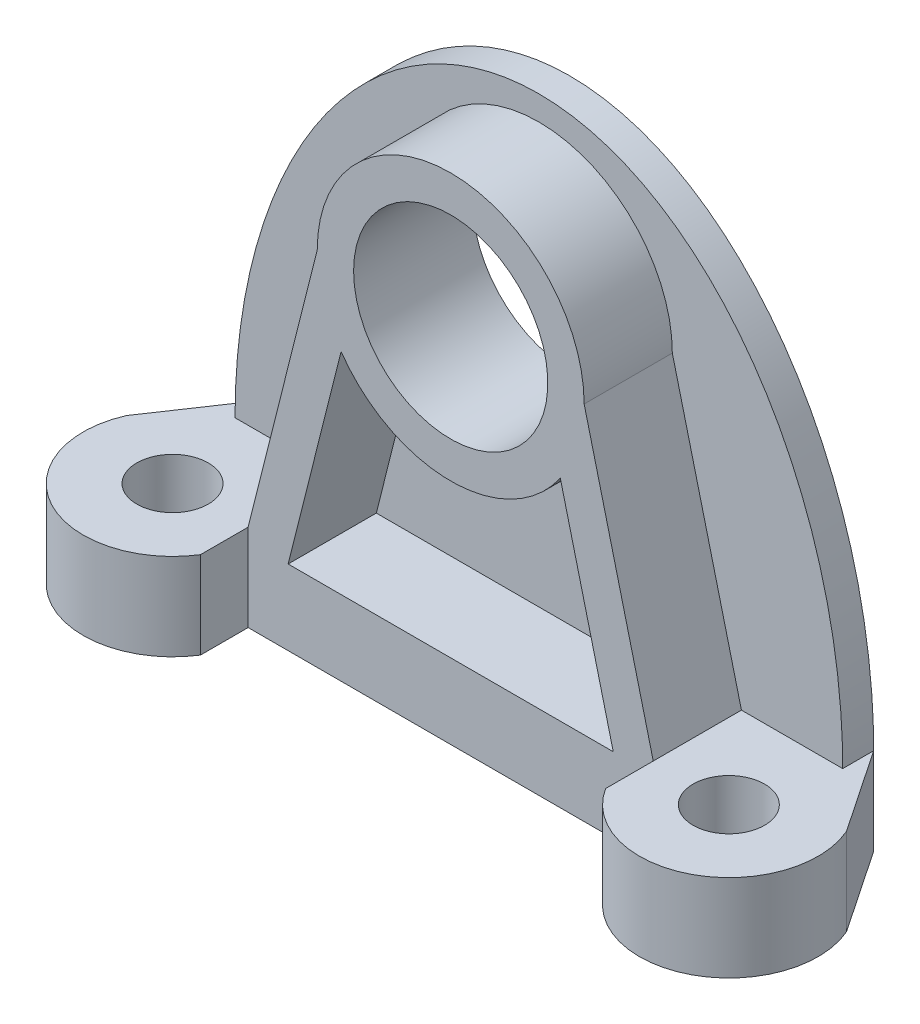
ISO-10303-21;
HEADER;
FILE_DESCRIPTION(('STEP AP214'),'2;1');
FILE_NAME('part.step','',(''),(''),'','','');
FILE_SCHEMA(('AUTOMOTIVE_DESIGN { 1 0 10303 214 1 1 1 1 }'));
ENDSEC;
DATA;
#1=APPLICATION_CONTEXT('core data for automotive mechanical design processes');
#2=APPLICATION_PROTOCOL_DEFINITION('international standard','automotive_design',2000,#1);
#3=PRODUCT_CONTEXT('',#1,'mechanical');
#4=PRODUCT('Part','Part','',(#3));
#5=PRODUCT_RELATED_PRODUCT_CATEGORY('part','',(#4));
#6=PRODUCT_DEFINITION_FORMATION('','',#4);
#7=PRODUCT_DEFINITION_CONTEXT('part definition',#1,'design');
#8=PRODUCT_DEFINITION('design','',#6,#7);
#9=PRODUCT_DEFINITION_SHAPE('','',#8);
#10=(LENGTH_UNIT() NAMED_UNIT(*) SI_UNIT(.MILLI.,.METRE.));
#11=(NAMED_UNIT(*) PLANE_ANGLE_UNIT() SI_UNIT($,.RADIAN.));
#12=(NAMED_UNIT(*) SI_UNIT($,.STERADIAN.) SOLID_ANGLE_UNIT());
#13=UNCERTAINTY_MEASURE_WITH_UNIT(LENGTH_MEASURE(1.E-05),#10,'distance_accuracy_value','');
#14=(GEOMETRIC_REPRESENTATION_CONTEXT(3) GLOBAL_UNCERTAINTY_ASSIGNED_CONTEXT((#13)) GLOBAL_UNIT_ASSIGNED_CONTEXT((#10,
#11,#12)) REPRESENTATION_CONTEXT('',''));
#15=CARTESIAN_POINT('',(0.,0.,0.));
#16=DIRECTION('',(0.,0.,1.));
#17=DIRECTION('',(1.,0.,0.));
#18=AXIS2_PLACEMENT_3D('',#15,#16,#17);
#19=CARTESIAN_POINT('',(-17.,7.3,14.));
#20=DIRECTION('',(-1.,0.,0.));
#21=DIRECTION('',(0.,0.,1.));
#22=AXIS2_PLACEMENT_3D('',#19,#20,#21);
#23=PLANE('',#22);
#24=DIRECTION('',(0.,-1.,0.));
#25=VECTOR('',#24,1.);
#26=CARTESIAN_POINT('',(-17.,7.3,10.));
#27=LINE('',#26,#25);
#28=CARTESIAN_POINT('',(-17.,7.3,10.));
#29=VERTEX_POINT('',#28);
#30=CARTESIAN_POINT('',(-17.,0.,10.));
#31=VERTEX_POINT('',#30);
#32=EDGE_CURVE('E167',#29,#31,#27,.T.);
#33=ORIENTED_EDGE('',*,*,#32,.F.);
#34=DIRECTION('',(0.,0.,-1.));
#35=VECTOR('',#34,1.);
#36=CARTESIAN_POINT('',(-17.,7.3,14.));
#37=LINE('',#36,#35);
#38=CARTESIAN_POINT('',(-17.,7.3,14.));
#39=VERTEX_POINT('',#38);
#40=EDGE_CURVE('E184',#39,#29,#37,.T.);
#41=ORIENTED_EDGE('',*,*,#40,.F.);
#42=DIRECTION('',(0.,-1.,0.));
#43=VECTOR('',#42,1.);
#44=CARTESIAN_POINT('',(-17.,7.3,14.));
#45=LINE('',#44,#43);
#46=CARTESIAN_POINT('',(-17.,0.,14.));
#47=VERTEX_POINT('',#46);
#48=EDGE_CURVE('E216',#39,#47,#45,.T.);
#49=ORIENTED_EDGE('',*,*,#48,.T.);
#50=DIRECTION('',(0.,0.,-1.));
#51=VECTOR('',#50,1.);
#52=CARTESIAN_POINT('',(-17.,0.,14.));
#53=LINE('',#52,#51);
#54=EDGE_CURVE('E205',#47,#31,#53,.T.);
#55=ORIENTED_EDGE('',*,*,#54,.T.);
#56=EDGE_LOOP('',(#33,#41,#49,#55));
#57=FACE_BOUND('',#56,.T.);
#58=ADVANCED_FACE('F32',(#57),#23,.F.);
#59=CARTESIAN_POINT('',(17.,7.3,14.));
#60=DIRECTION('',(1.,0.,0.));
#61=DIRECTION('',(0.,0.,-1.));
#62=AXIS2_PLACEMENT_3D('',#59,#60,#61);
#63=PLANE('',#62);
#64=DIRECTION('',(0.,0.,1.));
#65=VECTOR('',#64,1.);
#66=CARTESIAN_POINT('',(17.,7.3,14.));
#67=LINE('',#66,#65);
#68=CARTESIAN_POINT('',(17.,7.3,10.));
#69=VERTEX_POINT('',#68);
#70=CARTESIAN_POINT('',(17.,7.3,14.));
#71=VERTEX_POINT('',#70);
#72=EDGE_CURVE('E182',#69,#71,#67,.T.);
#73=ORIENTED_EDGE('',*,*,#72,.F.);
#74=DIRECTION('',(0.,-1.,0.));
#75=VECTOR('',#74,1.);
#76=CARTESIAN_POINT('',(17.,7.3,10.));
#77=LINE('',#76,#75);
#78=CARTESIAN_POINT('',(17.,0.,10.));
#79=VERTEX_POINT('',#78);
#80=EDGE_CURVE('E156',#69,#79,#77,.T.);
#81=ORIENTED_EDGE('',*,*,#80,.T.);
#82=DIRECTION('',(0.,0.,1.));
#83=VECTOR('',#82,1.);
#84=CARTESIAN_POINT('',(17.,0.,14.));
#85=LINE('',#84,#83);
#86=CARTESIAN_POINT('',(17.,0.,14.));
#87=VERTEX_POINT('',#86);
#88=EDGE_CURVE('E209',#79,#87,#85,.T.);
#89=ORIENTED_EDGE('',*,*,#88,.T.);
#90=DIRECTION('',(0.,-1.,0.));
#91=VECTOR('',#90,1.);
#92=CARTESIAN_POINT('',(17.,7.3,14.));
#93=LINE('',#92,#91);
#94=EDGE_CURVE('E168',#71,#87,#93,.T.);
#95=ORIENTED_EDGE('',*,*,#94,.F.);
#96=EDGE_LOOP('',(#73,#81,#89,#95));
#97=FACE_BOUND('',#96,.T.);
#98=ADVANCED_FACE('F183',(#97),#63,.F.);
#99=CARTESIAN_POINT('',(-17.,6.3,2.6));
#100=DIRECTION('',(0.,-1.,0.));
#101=DIRECTION('',(0.,0.,-1.));
#102=AXIS2_PLACEMENT_3D('',#99,#100,#101);
#103=PLANE('',#102);
#104=DIRECTION('',(0.,0.,-1.));
#105=VECTOR('',#104,1.);
#106=CARTESIAN_POINT('',(-13.642524215412,6.3,58.9751212351741));
#107=LINE('',#106,#105);
#108=CARTESIAN_POINT('',(-13.642524215412,6.3,10.));
#109=VERTEX_POINT('',#108);
#110=CARTESIAN_POINT('',(-13.642524215412,6.3,2.6));
#111=VERTEX_POINT('',#110);
#112=EDGE_CURVE('E353',#109,#111,#107,.T.);
#113=ORIENTED_EDGE('',*,*,#112,.F.);
#114=DIRECTION('',(1.,0.,0.));
#115=VECTOR('',#114,1.);
#116=CARTESIAN_POINT('',(-17.,6.3,10.));
#117=LINE('',#116,#115);
#118=CARTESIAN_POINT('',(13.642524215412,6.3,10.));
#119=VERTEX_POINT('',#118);
#120=EDGE_CURVE('E259',#109,#119,#117,.T.);
#121=ORIENTED_EDGE('',*,*,#120,.T.);
#122=DIRECTION('',(0.,0.,-1.));
#123=VECTOR('',#122,1.);
#124=CARTESIAN_POINT('',(13.642524215412,6.3,58.9751212351741));
#125=LINE('',#124,#123);
#126=CARTESIAN_POINT('',(13.642524215412,6.3,2.6));
#127=VERTEX_POINT('',#126);
#128=EDGE_CURVE('E179',#119,#127,#125,.T.);
#129=ORIENTED_EDGE('',*,*,#128,.T.);
#130=DIRECTION('',(1.,0.,0.));
#131=VECTOR('',#130,1.);
#132=CARTESIAN_POINT('',(-17.,6.3,2.6));
#133=LINE('',#132,#131);
#134=EDGE_CURVE('E256',#111,#127,#133,.T.);
#135=ORIENTED_EDGE('',*,*,#134,.F.);
#136=EDGE_LOOP('',(#113,#121,#129,#135));
#137=FACE_BOUND('',#136,.T.);
#138=ADVANCED_FACE('F285',(#137),#103,.F.);
#139=CARTESIAN_POINT('',(0.,0.,2.6));
#140=DIRECTION('',(0.,0.,1.));
#141=DIRECTION('',(1.,0.,0.));
#142=AXIS2_PLACEMENT_3D('',#139,#140,#141);
#143=PLANE('',#142);
#144=CARTESIAN_POINT('',(0.,30.35,2.6));
#145=DIRECTION('',(0.,0.,1.));
#146=DIRECTION('',(1.,0.,0.));
#147=AXIS2_PLACEMENT_3D('',#144,#145,#146);
#148=CIRCLE('',#147,11.2);
#149=CARTESIAN_POINT('',(11.2,30.35,2.6));
#150=VERTEX_POINT('',#149);
#151=CARTESIAN_POINT('',(-11.2,30.35,2.6));
#152=VERTEX_POINT('',#151);
#153=EDGE_CURVE('E359',#150,#152,#148,.T.);
#154=ORIENTED_EDGE('',*,*,#153,.F.);
#155=DIRECTION('',(-0.244020251184388,0.969770136172438,0.));
#156=VECTOR('',#155,1.);
#157=CARTESIAN_POINT('',(17.,7.3,2.6));
#158=LINE('',#157,#156);
#159=CARTESIAN_POINT('',(17.,7.3,2.6));
#160=VERTEX_POINT('',#159);
#161=EDGE_CURVE('E178',#160,#150,#158,.T.);
#162=ORIENTED_EDGE('',*,*,#161,.F.);
#163=DIRECTION('',(-1.,0.,0.));
#164=VECTOR('',#163,1.);
#165=CARTESIAN_POINT('',(25.5,7.3,2.59999999999999));
#166=LINE('',#165,#164);
#167=CARTESIAN_POINT('',(25.5,7.3,2.59999999999999));
#168=VERTEX_POINT('',#167);
#169=EDGE_CURVE('E189',#168,#160,#166,.T.);
#170=ORIENTED_EDGE('',*,*,#169,.F.);
#171=CARTESIAN_POINT('',(0.,7.3,2.59999999999999));
#172=DIRECTION('',(0.,0.,-1.));
#173=DIRECTION('',(0.,-1.,0.));
#174=AXIS2_PLACEMENT_3D('',#171,#172,#173);
#175=ELLIPSE('',#174,36.3,25.5);
#176=CARTESIAN_POINT('',(-25.5,7.3,2.59999999999999));
#177=VERTEX_POINT('',#176);
#178=EDGE_CURVE('E333',#177,#168,#175,.T.);
#179=ORIENTED_EDGE('',*,*,#178,.F.);
#180=CARTESIAN_POINT('',(-17.,7.3,2.6));
#181=VERTEX_POINT('',#180);
#182=EDGE_CURVE('E332',#181,#177,#166,.T.);
#183=ORIENTED_EDGE('',*,*,#182,.F.);
#184=DIRECTION('',(-0.244020251184388,-0.969770136172438,0.));
#185=VECTOR('',#184,1.);
#186=CARTESIAN_POINT('',(-17.,7.3,2.6));
#187=LINE('',#186,#185);
#188=EDGE_CURVE('E368',#152,#181,#187,.T.);
#189=ORIENTED_EDGE('',*,*,#188,.F.);
#190=EDGE_LOOP('',(#154,#162,#170,#179,#183,#189));
#191=FACE_BOUND('',#190,.T.);
#192=ADVANCED_FACE('F281',(#191),#143,.T.);
#193=CARTESIAN_POINT('',(0.,30.35,2.6));
#194=DIRECTION('',(0.,0.,1.));
#195=DIRECTION('',(1.,0.,0.));
#196=AXIS2_PLACEMENT_3D('',#193,#194,#195);
#197=CIRCLE('',#196,11.2);
#198=CARTESIAN_POINT('',(-9.19865015464646,23.9605684656284,2.6));
#199=VERTEX_POINT('',#198);
#200=CARTESIAN_POINT('',(9.19865015464646,23.9605684656284,2.6));
#201=VERTEX_POINT('',#200);
#202=EDGE_CURVE('E47',#199,#201,#197,.T.);
#203=ORIENTED_EDGE('',*,*,#202,.F.);
#204=DIRECTION('',(0.244020251184388,0.969770136172438,0.));
#205=VECTOR('',#204,1.);
#206=CARTESIAN_POINT('',(-13.642524215412,6.3,2.6));
#207=LINE('',#206,#205);
#208=EDGE_CURVE('E350',#111,#199,#207,.T.);
#209=ORIENTED_EDGE('',*,*,#208,.F.);
#210=ORIENTED_EDGE('',*,*,#134,.T.);
#211=DIRECTION('',(0.244020251184388,-0.969770136172438,0.));
#212=VECTOR('',#211,1.);
#213=CARTESIAN_POINT('',(13.642524215412,6.3,2.6));
#214=LINE('',#213,#212);
#215=EDGE_CURVE('E338',#201,#127,#214,.T.);
#216=ORIENTED_EDGE('',*,*,#215,.F.);
#217=EDGE_LOOP('',(#203,#209,#210,#216));
#218=FACE_BOUND('',#217,.T.);
#219=ADVANCED_FACE('F284',(#218),#143,.T.);
#220=CARTESIAN_POINT('',(23.3442887702248,7.3,10.));
#221=DIRECTION('',(0.,-1.,0.));
#222=DIRECTION('',(0.,0.,-1.));
#223=AXIS2_PLACEMENT_3D('',#220,#221,#222);
#224=PLANE('',#223);
#225=CARTESIAN_POINT('',(23.3442887702248,7.3,10.));
#226=DIRECTION('',(0.,1.,0.));
#227=DIRECTION('',(0.,0.,1.));
#228=AXIS2_PLACEMENT_3D('',#225,#226,#227);
#229=CIRCLE('',#228,3.);
#230=CARTESIAN_POINT('',(23.3442887702248,7.3,13.));
#231=VERTEX_POINT('',#230);
#232=EDGE_CURVE('E199',#231,#231,#229,.T.);
#233=ORIENTED_EDGE('',*,*,#232,.F.);
#234=EDGE_LOOP('',(#233));
#235=FACE_BOUND('',#234,.T.);
#236=DIRECTION('',(-0.558915454806079,0.,-0.829224646509566));
#237=VECTOR('',#236,1.);
#238=CARTESIAN_POINT('',(25.5,7.3,0.));
#239=LINE('',#238,#237);
#240=CARTESIAN_POINT('',(30.2181523126585,7.3,7.));
#241=VERTEX_POINT('',#240);
#242=CARTESIAN_POINT('',(25.5,7.3,0.));
#243=VERTEX_POINT('',#242);
#244=EDGE_CURVE('E212',#241,#243,#239,.T.);
#245=ORIENTED_EDGE('',*,*,#244,.T.);
#246=DIRECTION('',(0.,0.,-1.));
#247=VECTOR('',#246,1.);
#248=CARTESIAN_POINT('',(25.5,7.3,65.1994408920719));
#249=LINE('',#248,#247);
#250=EDGE_CURVE('E267',#168,#243,#249,.T.);
#251=ORIENTED_EDGE('',*,*,#250,.F.);
#252=ORIENTED_EDGE('',*,*,#169,.T.);
#253=EDGE_CURVE('E174',#160,#69,#67,.T.);
#254=ORIENTED_EDGE('',*,*,#253,.T.);
#255=ORIENTED_EDGE('',*,*,#72,.T.);
#256=CARTESIAN_POINT('',(23.3442887702248,7.3,10.));
#257=DIRECTION('',(0.,1.,0.));
#258=DIRECTION('',(0.,0.,-1.));
#259=AXIS2_PLACEMENT_3D('',#256,#257,#258);
#260=CIRCLE('',#259,7.5);
#261=EDGE_CURVE('E56',#71,#241,#260,.T.);
#262=ORIENTED_EDGE('',*,*,#261,.T.);
#263=EDGE_LOOP('',(#245,#251,#252,#254,#255,#262));
#264=FACE_BOUND('',#263,.T.);
#265=ADVANCED_FACE('F187',(#235,#264),#224,.F.);
#266=ORIENTED_EDGE('',*,*,#182,.T.);
#267=DIRECTION('',(0.,0.,-1.));
#268=VECTOR('',#267,1.);
#269=CARTESIAN_POINT('',(-25.5,7.3,65.1994408920719));
#270=LINE('',#269,#268);
#271=CARTESIAN_POINT('',(-25.5,7.3,0.));
#272=VERTEX_POINT('',#271);
#273=EDGE_CURVE('E326',#177,#272,#270,.T.);
#274=ORIENTED_EDGE('',*,*,#273,.T.);
#275=DIRECTION('',(-0.558915454806079,0.,0.829224646509566));
#276=VECTOR('',#275,1.);
#277=CARTESIAN_POINT('',(-25.5,7.3,0.));
#278=LINE('',#277,#276);
#279=CARTESIAN_POINT('',(-30.2181523126585,7.3,7.));
#280=VERTEX_POINT('',#279);
#281=EDGE_CURVE('E97',#272,#280,#278,.T.);
#282=ORIENTED_EDGE('',*,*,#281,.T.);
#283=CARTESIAN_POINT('',(-23.3442887702248,7.3,10.));
#284=DIRECTION('',(0.,1.,0.));
#285=DIRECTION('',(0.,0.,1.));
#286=AXIS2_PLACEMENT_3D('',#283,#284,#285);
#287=CIRCLE('',#286,7.5);
#288=EDGE_CURVE('E243',#280,#39,#287,.T.);
#289=ORIENTED_EDGE('',*,*,#288,.T.);
#290=ORIENTED_EDGE('',*,*,#40,.T.);
#291=DIRECTION('',(0.,0.,-1.));
#292=VECTOR('',#291,1.);
#293=CARTESIAN_POINT('',(-17.,7.3,58.9751212351741));
#294=LINE('',#293,#292);
#295=EDGE_CURVE('E354',#29,#181,#294,.T.);
#296=ORIENTED_EDGE('',*,*,#295,.T.);
#297=EDGE_LOOP('',(#266,#274,#282,#289,#290,#296));
#298=FACE_BOUND('',#297,.T.);
#299=CARTESIAN_POINT('',(-23.3442887702248,7.3,10.));
#300=DIRECTION('',(0.,1.,0.));
#301=DIRECTION('',(0.,0.,-1.));
#302=AXIS2_PLACEMENT_3D('',#299,#300,#301);
#303=CIRCLE('',#302,3.);
#304=CARTESIAN_POINT('',(-23.3442887702248,7.3,7.));
#305=VERTEX_POINT('',#304);
#306=EDGE_CURVE('E250',#305,#305,#303,.T.);
#307=ORIENTED_EDGE('',*,*,#306,.F.);
#308=EDGE_LOOP('',(#307));
#309=FACE_BOUND('',#308,.T.);
#310=ADVANCED_FACE('F298',(#298,#309),#224,.F.);
#311=CARTESIAN_POINT('',(23.3442887702248,0.,10.));
#312=DIRECTION('',(0.,-1.,0.));
#313=DIRECTION('',(0.,0.,-1.));
#314=AXIS2_PLACEMENT_3D('',#311,#312,#313);
#315=PLANE('',#314);
#316=CARTESIAN_POINT('',(23.3442887702248,0.,10.));
#317=DIRECTION('',(0.,1.,0.));
#318=DIRECTION('',(0.,0.,1.));
#319=AXIS2_PLACEMENT_3D('',#316,#317,#318);
#320=CIRCLE('',#319,3.);
#321=CARTESIAN_POINT('',(23.3442887702248,0.,13.));
#322=VERTEX_POINT('',#321);
#323=EDGE_CURVE('E247',#322,#322,#320,.T.);
#324=ORIENTED_EDGE('',*,*,#323,.T.);
#325=EDGE_LOOP('',(#324));
#326=FACE_BOUND('',#325,.T.);
#327=DIRECTION('',(-0.558915454806079,0.,-0.829224646509566));
#328=VECTOR('',#327,1.);
#329=CARTESIAN_POINT('',(25.5,0.,0.));
#330=LINE('',#329,#328);
#331=CARTESIAN_POINT('',(30.2181523126585,0.,7.));
#332=VERTEX_POINT('',#331);
#333=CARTESIAN_POINT('',(25.5,0.,0.));
#334=VERTEX_POINT('',#333);
#335=EDGE_CURVE('E195',#332,#334,#330,.T.);
#336=ORIENTED_EDGE('',*,*,#335,.F.);
#337=CARTESIAN_POINT('',(23.3442887702248,0.,10.));
#338=DIRECTION('',(0.,1.,0.));
#339=DIRECTION('',(0.,0.,-1.));
#340=AXIS2_PLACEMENT_3D('',#337,#338,#339);
#341=CIRCLE('',#340,7.5);
#342=EDGE_CURVE('E89',#87,#332,#341,.T.);
#343=ORIENTED_EDGE('',*,*,#342,.F.);
#344=ORIENTED_EDGE('',*,*,#88,.F.);
#345=DIRECTION('',(1.,0.,0.));
#346=VECTOR('',#345,1.);
#347=CARTESIAN_POINT('',(17.,0.,10.));
#348=LINE('',#347,#346);
#349=EDGE_CURVE('E163',#31,#79,#348,.T.);
#350=ORIENTED_EDGE('',*,*,#349,.F.);
#351=ORIENTED_EDGE('',*,*,#54,.F.);
#352=CARTESIAN_POINT('',(-23.3442887702248,0.,10.));
#353=DIRECTION('',(0.,1.,0.));
#354=DIRECTION('',(0.,0.,1.));
#355=AXIS2_PLACEMENT_3D('',#352,#353,#354);
#356=CIRCLE('',#355,7.5);
#357=CARTESIAN_POINT('',(-30.2181523126585,0.,7.));
#358=VERTEX_POINT('',#357);
#359=EDGE_CURVE('E203',#358,#47,#356,.T.);
#360=ORIENTED_EDGE('',*,*,#359,.F.);
#361=DIRECTION('',(-0.558915454806079,0.,0.829224646509566));
#362=VECTOR('',#361,1.);
#363=CARTESIAN_POINT('',(-25.5,0.,0.));
#364=LINE('',#363,#362);
#365=CARTESIAN_POINT('',(-25.5,0.,0.));
#366=VERTEX_POINT('',#365);
#367=EDGE_CURVE('E201',#366,#358,#364,.T.);
#368=ORIENTED_EDGE('',*,*,#367,.F.);
#369=DIRECTION('',(-1.,0.,0.));
#370=VECTOR('',#369,1.);
#371=CARTESIAN_POINT('',(-25.5,0.,0.));
#372=LINE('',#371,#370);
#373=EDGE_CURVE('E198',#334,#366,#372,.T.);
#374=ORIENTED_EDGE('',*,*,#373,.F.);
#375=EDGE_LOOP('',(#336,#343,#344,#350,#351,#360,#368,#374));
#376=FACE_BOUND('',#375,.T.);
#377=CARTESIAN_POINT('',(-23.3442887702248,0.,10.));
#378=DIRECTION('',(0.,1.,0.));
#379=DIRECTION('',(0.,0.,-1.));
#380=AXIS2_PLACEMENT_3D('',#377,#378,#379);
#381=CIRCLE('',#380,3.);
#382=CARTESIAN_POINT('',(-23.3442887702248,0.,7.));
#383=VERTEX_POINT('',#382);
#384=EDGE_CURVE('E253',#383,#383,#381,.T.);
#385=ORIENTED_EDGE('',*,*,#384,.T.);
#386=EDGE_LOOP('',(#385));
#387=FACE_BOUND('',#386,.T.);
#388=ADVANCED_FACE('F231',(#326,#376,#387),#315,.T.);
#389=CARTESIAN_POINT('',(25.5,7.3,0.));
#390=DIRECTION('',(-0.829224646509566,0.,0.558915454806079));
#391=DIRECTION('',(0.558915454806079,0.,0.829224646509566));
#392=AXIS2_PLACEMENT_3D('',#389,#390,#391);
#393=PLANE('',#392);
#394=ORIENTED_EDGE('',*,*,#335,.T.);
#395=DIRECTION('',(0.,-1.,0.));
#396=VECTOR('',#395,1.);
#397=CARTESIAN_POINT('',(25.5,7.3,0.));
#398=LINE('',#397,#396);
#399=EDGE_CURVE('E11',#243,#334,#398,.T.);
#400=ORIENTED_EDGE('',*,*,#399,.F.);
#401=ORIENTED_EDGE('',*,*,#244,.F.);
#402=DIRECTION('',(0.,-1.,0.));
#403=VECTOR('',#402,1.);
#404=CARTESIAN_POINT('',(30.2181523126585,7.3,7.));
#405=LINE('',#404,#403);
#406=EDGE_CURVE('E190',#241,#332,#405,.T.);
#407=ORIENTED_EDGE('',*,*,#406,.T.);
#408=EDGE_LOOP('',(#394,#400,#401,#407));
#409=FACE_BOUND('',#408,.T.);
#410=ADVANCED_FACE('F34',(#409),#393,.F.);
#411=CARTESIAN_POINT('',(-25.5,7.3,0.));
#412=DIRECTION('',(0.,0.,1.));
#413=DIRECTION('',(1.,0.,0.));
#414=AXIS2_PLACEMENT_3D('',#411,#412,#413);
#415=PLANE('',#414);
#416=ORIENTED_EDGE('',*,*,#373,.T.);
#417=DIRECTION('',(0.,-1.,0.));
#418=VECTOR('',#417,1.);
#419=CARTESIAN_POINT('',(-25.5,7.3,0.));
#420=LINE('',#419,#418);
#421=EDGE_CURVE('E40',#272,#366,#420,.T.);
#422=ORIENTED_EDGE('',*,*,#421,.F.);
#423=CARTESIAN_POINT('',(0.,7.3,0.));
#424=DIRECTION('',(0.,0.,-1.));
#425=DIRECTION('',(0.,-1.,0.));
#426=AXIS2_PLACEMENT_3D('',#423,#424,#425);
#427=ELLIPSE('',#426,36.3,25.5);
#428=EDGE_CURVE('E262',#272,#243,#427,.T.);
#429=ORIENTED_EDGE('',*,*,#428,.T.);
#430=ORIENTED_EDGE('',*,*,#399,.T.);
#431=EDGE_LOOP('',(#416,#422,#429,#430));
#432=FACE_BOUND('',#431,.T.);
#433=CARTESIAN_POINT('',(0.,30.35,0.));
#434=DIRECTION('',(0.,0.,-1.));
#435=DIRECTION('',(-1.,0.,0.));
#436=AXIS2_PLACEMENT_3D('',#433,#434,#435);
#437=CIRCLE('',#436,8.15);
#438=CARTESIAN_POINT('',(-8.15,30.35,0.));
#439=VERTEX_POINT('',#438);
#440=EDGE_CURVE('E325',#439,#439,#437,.T.);
#441=ORIENTED_EDGE('',*,*,#440,.F.);
#442=EDGE_LOOP('',(#441));
#443=FACE_BOUND('',#442,.T.);
#444=ADVANCED_FACE('F316',(#432,#443),#415,.F.);
#445=CARTESIAN_POINT('',(-25.5,7.3,0.));
#446=DIRECTION('',(0.829224646509566,0.,0.558915454806079));
#447=DIRECTION('',(0.558915454806079,0.,-0.829224646509566));
#448=AXIS2_PLACEMENT_3D('',#445,#446,#447);
#449=PLANE('',#448);
#450=ORIENTED_EDGE('',*,*,#367,.T.);
#451=DIRECTION('',(0.,-1.,0.));
#452=VECTOR('',#451,1.);
#453=CARTESIAN_POINT('',(-30.2181523126585,7.3,7.));
#454=LINE('',#453,#452);
#455=EDGE_CURVE('E219',#280,#358,#454,.T.);
#456=ORIENTED_EDGE('',*,*,#455,.F.);
#457=ORIENTED_EDGE('',*,*,#281,.F.);
#458=ORIENTED_EDGE('',*,*,#421,.T.);
#459=EDGE_LOOP('',(#450,#456,#457,#458));
#460=FACE_BOUND('',#459,.T.);
#461=ADVANCED_FACE('F225',(#460),#449,.F.);
#462=CARTESIAN_POINT('',(-23.3442887702248,7.3,10.));
#463=DIRECTION('',(0.,-1.,0.));
#464=DIRECTION('',(0.,0.,-1.));
#465=AXIS2_PLACEMENT_3D('',#462,#463,#464);
#466=CYLINDRICAL_SURFACE('',#465,7.5);
#467=ORIENTED_EDGE('',*,*,#359,.T.);
#468=ORIENTED_EDGE('',*,*,#48,.F.);
#469=ORIENTED_EDGE('',*,*,#288,.F.);
#470=ORIENTED_EDGE('',*,*,#455,.T.);
#471=EDGE_LOOP('',(#467,#468,#469,#470));
#472=FACE_BOUND('',#471,.T.);
#473=ADVANCED_FACE('F236',(#472),#466,.T.);
#474=CARTESIAN_POINT('',(17.,7.3,10.));
#475=DIRECTION('',(0.,0.,-1.));
#476=DIRECTION('',(-1.,0.,0.));
#477=AXIS2_PLACEMENT_3D('',#474,#475,#476);
#478=PLANE('',#477);
#479=ORIENTED_EDGE('',*,*,#120,.F.);
#480=DIRECTION('',(-0.244020251184388,-0.969770136172438,0.));
#481=VECTOR('',#480,1.);
#482=CARTESIAN_POINT('',(-13.642524215412,6.3,10.));
#483=LINE('',#482,#481);
#484=CARTESIAN_POINT('',(-9.19865015464646,23.9605684656284,10.));
#485=VERTEX_POINT('',#484);
#486=EDGE_CURVE('E351',#485,#109,#483,.T.);
#487=ORIENTED_EDGE('',*,*,#486,.F.);
#488=CARTESIAN_POINT('',(0.,30.35,10.));
#489=DIRECTION('',(0.,0.,-1.));
#490=DIRECTION('',(-1.,0.,0.));
#491=AXIS2_PLACEMENT_3D('',#488,#489,#490);
#492=CIRCLE('',#491,11.2);
#493=CARTESIAN_POINT('',(9.19865015464646,23.9605684656284,10.));
#494=VERTEX_POINT('',#493);
#495=EDGE_CURVE('E346',#494,#485,#492,.T.);
#496=ORIENTED_EDGE('',*,*,#495,.F.);
#497=DIRECTION('',(-0.244020251184388,0.969770136172438,0.));
#498=VECTOR('',#497,1.);
#499=CARTESIAN_POINT('',(13.642524215412,6.3,10.));
#500=LINE('',#499,#498);
#501=EDGE_CURVE('E343',#119,#494,#500,.T.);
#502=ORIENTED_EDGE('',*,*,#501,.F.);
#503=EDGE_LOOP('',(#479,#487,#496,#502));
#504=FACE_BOUND('',#503,.T.);
#505=ORIENTED_EDGE('',*,*,#80,.F.);
#506=DIRECTION('',(0.244020251184388,-0.969770136172438,0.));
#507=VECTOR('',#506,1.);
#508=CARTESIAN_POINT('',(17.,7.3,10.));
#509=LINE('',#508,#507);
#510=CARTESIAN_POINT('',(11.2,30.35,10.));
#511=VERTEX_POINT('',#510);
#512=EDGE_CURVE('E160',#511,#69,#509,.T.);
#513=ORIENTED_EDGE('',*,*,#512,.F.);
#514=CARTESIAN_POINT('',(0.,30.35,10.));
#515=DIRECTION('',(0.,0.,-1.));
#516=DIRECTION('',(-1.,0.,0.));
#517=AXIS2_PLACEMENT_3D('',#514,#515,#516);
#518=CIRCLE('',#517,11.2);
#519=CARTESIAN_POINT('',(-11.2,30.35,10.));
#520=VERTEX_POINT('',#519);
#521=EDGE_CURVE('E360',#520,#511,#518,.T.);
#522=ORIENTED_EDGE('',*,*,#521,.F.);
#523=DIRECTION('',(0.244020251184388,0.969770136172438,0.));
#524=VECTOR('',#523,1.);
#525=CARTESIAN_POINT('',(-17.,7.3,10.));
#526=LINE('',#525,#524);
#527=EDGE_CURVE('E355',#29,#520,#526,.T.);
#528=ORIENTED_EDGE('',*,*,#527,.F.);
#529=ORIENTED_EDGE('',*,*,#32,.T.);
#530=ORIENTED_EDGE('',*,*,#349,.T.);
#531=EDGE_LOOP('',(#505,#513,#522,#528,#529,#530));
#532=FACE_BOUND('',#531,.T.);
#533=CARTESIAN_POINT('',(0.,30.35,10.));
#534=DIRECTION('',(0.,0.,-1.));
#535=DIRECTION('',(-1.,0.,0.));
#536=AXIS2_PLACEMENT_3D('',#533,#534,#535);
#537=CIRCLE('',#536,8.15);
#538=CARTESIAN_POINT('',(-8.15,30.35,10.));
#539=VERTEX_POINT('',#538);
#540=EDGE_CURVE('E335',#539,#539,#537,.T.);
#541=ORIENTED_EDGE('',*,*,#540,.T.);
#542=EDGE_LOOP('',(#541));
#543=FACE_BOUND('',#542,.T.);
#544=ADVANCED_FACE('F158',(#504,#532,#543),#478,.F.);
#545=CARTESIAN_POINT('',(23.3442887702248,7.3,10.));
#546=DIRECTION('',(0.,-1.,0.));
#547=DIRECTION('',(0.,0.,-1.));
#548=AXIS2_PLACEMENT_3D('',#545,#546,#547);
#549=CYLINDRICAL_SURFACE('',#548,7.5);
#550=ORIENTED_EDGE('',*,*,#342,.T.);
#551=ORIENTED_EDGE('',*,*,#406,.F.);
#552=ORIENTED_EDGE('',*,*,#261,.F.);
#553=ORIENTED_EDGE('',*,*,#94,.T.);
#554=EDGE_LOOP('',(#550,#551,#552,#553));
#555=FACE_BOUND('',#554,.T.);
#556=ADVANCED_FACE('F296',(#555),#549,.T.);
#557=CARTESIAN_POINT('',(23.3442887702248,7.3,10.));
#558=DIRECTION('',(0.,-1.,0.));
#559=DIRECTION('',(0.,0.,-1.));
#560=AXIS2_PLACEMENT_3D('',#557,#558,#559);
#561=CYLINDRICAL_SURFACE('',#560,3.);
#562=ORIENTED_EDGE('',*,*,#232,.T.);
#563=EDGE_LOOP('',(#562));
#564=FACE_BOUND('',#563,.T.);
#565=ORIENTED_EDGE('',*,*,#323,.F.);
#566=EDGE_LOOP('',(#565));
#567=FACE_BOUND('',#566,.T.);
#568=ADVANCED_FACE('F292',(#564,#567),#561,.F.);
#569=CARTESIAN_POINT('',(-23.3442887702248,7.3,10.));
#570=DIRECTION('',(0.,-1.,0.));
#571=DIRECTION('',(0.,0.,-1.));
#572=AXIS2_PLACEMENT_3D('',#569,#570,#571);
#573=CYLINDRICAL_SURFACE('',#572,3.);
#574=ORIENTED_EDGE('',*,*,#306,.T.);
#575=EDGE_LOOP('',(#574));
#576=FACE_BOUND('',#575,.T.);
#577=ORIENTED_EDGE('',*,*,#384,.F.);
#578=EDGE_LOOP('',(#577));
#579=FACE_BOUND('',#578,.T.);
#580=ADVANCED_FACE('F275',(#576,#579),#573,.F.);
#581=CARTESIAN_POINT('',(0.,7.3,65.1994408920719));
#582=DIRECTION('',(0.,0.,-1.));
#583=DIRECTION('',(0.,-1.,0.));
#584=AXIS2_PLACEMENT_3D('',#581,#582,#583);
#585=ELLIPSE('',#584,36.3,25.5);
#586=DIRECTION('',(0.,0.,-1.));
#587=VECTOR('',#586,1.);
#588=SURFACE_OF_LINEAR_EXTRUSION('',#585,#587);
#589=ORIENTED_EDGE('',*,*,#273,.F.);
#590=ORIENTED_EDGE('',*,*,#178,.T.);
#591=ORIENTED_EDGE('',*,*,#250,.T.);
#592=ORIENTED_EDGE('',*,*,#428,.F.);
#593=EDGE_LOOP('',(#589,#590,#591,#592));
#594=FACE_BOUND('',#593,.T.);
#595=ADVANCED_FACE('F270',(#594),#588,.T.);
#596=CARTESIAN_POINT('',(0.,30.35,65.1994408920719));
#597=DIRECTION('',(0.,0.,-1.));
#598=DIRECTION('',(-1.,0.,0.));
#599=AXIS2_PLACEMENT_3D('',#596,#597,#598);
#600=CYLINDRICAL_SURFACE('',#599,8.15);
#601=ORIENTED_EDGE('',*,*,#440,.T.);
#602=EDGE_LOOP('',(#601));
#603=FACE_BOUND('',#602,.T.);
#604=ORIENTED_EDGE('',*,*,#540,.F.);
#605=EDGE_LOOP('',(#604));
#606=FACE_BOUND('',#605,.T.);
#607=ADVANCED_FACE('F274',(#603,#606),#600,.F.);
#608=CARTESIAN_POINT('',(17.,7.3,58.9751212351741));
#609=DIRECTION('',(-0.969770136172438,-0.244020251184388,0.));
#610=DIRECTION('',(0.244020251184388,-0.969770136172438,0.));
#611=AXIS2_PLACEMENT_3D('',#608,#609,#610);
#612=PLANE('',#611);
#613=DIRECTION('',(0.,0.,-1.));
#614=VECTOR('',#613,1.);
#615=CARTESIAN_POINT('',(11.2,30.35,58.9751212351741));
#616=LINE('',#615,#614);
#617=EDGE_CURVE('E176',#511,#150,#616,.T.);
#618=ORIENTED_EDGE('',*,*,#617,.F.);
#619=ORIENTED_EDGE('',*,*,#512,.T.);
#620=ORIENTED_EDGE('',*,*,#253,.F.);
#621=ORIENTED_EDGE('',*,*,#161,.T.);
#622=EDGE_LOOP('',(#618,#619,#620,#621));
#623=FACE_BOUND('',#622,.T.);
#624=ADVANCED_FACE('F171',(#623),#612,.F.);
#625=CARTESIAN_POINT('',(0.,30.35,58.9751212351741));
#626=DIRECTION('',(0.,0.,-1.));
#627=DIRECTION('',(-1.,0.,0.));
#628=AXIS2_PLACEMENT_3D('',#625,#626,#627);
#629=CYLINDRICAL_SURFACE('',#628,11.2);
#630=DIRECTION('',(0.,0.,-1.));
#631=VECTOR('',#630,1.);
#632=CARTESIAN_POINT('',(-11.2,30.35,58.9751212351741));
#633=LINE('',#632,#631);
#634=EDGE_CURVE('E358',#520,#152,#633,.T.);
#635=ORIENTED_EDGE('',*,*,#634,.F.);
#636=ORIENTED_EDGE('',*,*,#521,.T.);
#637=ORIENTED_EDGE('',*,*,#617,.T.);
#638=ORIENTED_EDGE('',*,*,#153,.T.);
#639=EDGE_LOOP('',(#635,#636,#637,#638));
#640=FACE_BOUND('',#639,.T.);
#641=ADVANCED_FACE('F401',(#640),#629,.T.);
#642=CARTESIAN_POINT('',(-17.,7.3,58.9751212351741));
#643=DIRECTION('',(0.969770136172438,-0.244020251184388,0.));
#644=DIRECTION('',(0.244020251184388,0.969770136172438,0.));
#645=AXIS2_PLACEMENT_3D('',#642,#643,#644);
#646=PLANE('',#645);
#647=ORIENTED_EDGE('',*,*,#295,.F.);
#648=ORIENTED_EDGE('',*,*,#527,.T.);
#649=ORIENTED_EDGE('',*,*,#634,.T.);
#650=ORIENTED_EDGE('',*,*,#188,.T.);
#651=EDGE_LOOP('',(#647,#648,#649,#650));
#652=FACE_BOUND('',#651,.T.);
#653=ADVANCED_FACE('F397',(#652),#646,.F.);
#654=CARTESIAN_POINT('',(-13.642524215412,6.3,58.9751212351741));
#655=DIRECTION('',(-0.969770136172438,0.244020251184388,0.));
#656=DIRECTION('',(-0.244020251184388,-0.969770136172438,0.));
#657=AXIS2_PLACEMENT_3D('',#654,#655,#656);
#658=PLANE('',#657);
#659=DIRECTION('',(0.,0.,-1.));
#660=VECTOR('',#659,1.);
#661=CARTESIAN_POINT('',(-9.19865015464646,23.9605684656284,58.9751212351741));
#662=LINE('',#661,#660);
#663=EDGE_CURVE('E349',#485,#199,#662,.T.);
#664=ORIENTED_EDGE('',*,*,#663,.F.);
#665=ORIENTED_EDGE('',*,*,#486,.T.);
#666=ORIENTED_EDGE('',*,*,#112,.T.);
#667=ORIENTED_EDGE('',*,*,#208,.T.);
#668=EDGE_LOOP('',(#664,#665,#666,#667));
#669=FACE_BOUND('',#668,.T.);
#670=ADVANCED_FACE('F380',(#669),#658,.F.);
#671=CARTESIAN_POINT('',(0.,30.35,58.9751212351741));
#672=DIRECTION('',(0.,0.,-1.));
#673=DIRECTION('',(-1.,0.,0.));
#674=AXIS2_PLACEMENT_3D('',#671,#672,#673);
#675=CYLINDRICAL_SURFACE('',#674,11.2);
#676=DIRECTION('',(0.,0.,-1.));
#677=VECTOR('',#676,1.);
#678=CARTESIAN_POINT('',(9.19865015464646,23.9605684656284,58.9751212351741));
#679=LINE('',#678,#677);
#680=EDGE_CURVE('E340',#494,#201,#679,.T.);
#681=ORIENTED_EDGE('',*,*,#680,.F.);
#682=ORIENTED_EDGE('',*,*,#495,.T.);
#683=ORIENTED_EDGE('',*,*,#663,.T.);
#684=ORIENTED_EDGE('',*,*,#202,.T.);
#685=EDGE_LOOP('',(#681,#682,#683,#684));
#686=FACE_BOUND('',#685,.T.);
#687=ADVANCED_FACE('F389',(#686),#675,.T.);
#688=CARTESIAN_POINT('',(13.642524215412,6.3,58.9751212351741));
#689=DIRECTION('',(0.969770136172438,0.244020251184388,0.));
#690=DIRECTION('',(-0.244020251184388,0.969770136172438,0.));
#691=AXIS2_PLACEMENT_3D('',#688,#689,#690);
#692=PLANE('',#691);
#693=ORIENTED_EDGE('',*,*,#128,.F.);
#694=ORIENTED_EDGE('',*,*,#501,.T.);
#695=ORIENTED_EDGE('',*,*,#680,.T.);
#696=ORIENTED_EDGE('',*,*,#215,.T.);
#697=EDGE_LOOP('',(#693,#694,#695,#696));
#698=FACE_BOUND('',#697,.T.);
#699=ADVANCED_FACE('F387',(#698),#692,.F.);
#700=CLOSED_SHELL('',(#58,#98,#138,#192,#219,#265,#310,#388,#410,#444,#461,#473,#544,#556,#568,
#580,#595,#607,#624,#641,#653,#670,#687,#699));
#701=MANIFOLD_SOLID_BREP('B2',#700);
#702=ADVANCED_BREP_SHAPE_REPRESENTATION('',(#18,#701),#14);
#703=SHAPE_DEFINITION_REPRESENTATION(#9,#702);
ENDSEC;
END-ISO-10303-21;
